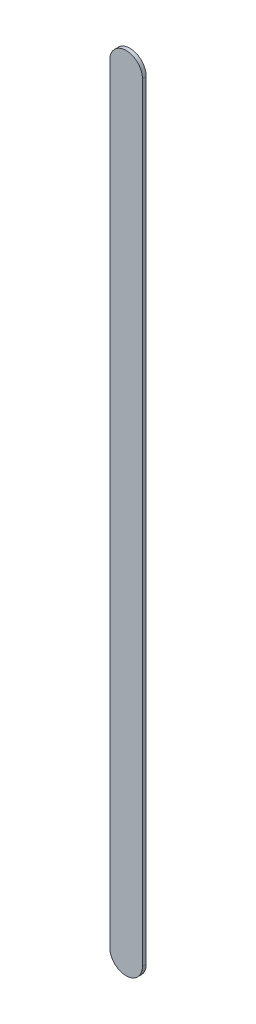
ISO-10303-21;
HEADER;
FILE_DESCRIPTION(('STEP AP214'),'2;1');
FILE_NAME('part.step','',(''),(''),'','','');
FILE_SCHEMA(('AUTOMOTIVE_DESIGN { 1 0 10303 214 1 1 1 1 }'));
ENDSEC;
DATA;
#1=APPLICATION_CONTEXT('core data for automotive mechanical design processes');
#2=APPLICATION_PROTOCOL_DEFINITION('international standard','automotive_design',2000,#1);
#3=PRODUCT_CONTEXT('',#1,'mechanical');
#4=PRODUCT('Part','Part','',(#3));
#5=PRODUCT_RELATED_PRODUCT_CATEGORY('part','',(#4));
#6=PRODUCT_DEFINITION_FORMATION('','',#4);
#7=PRODUCT_DEFINITION_CONTEXT('part definition',#1,'design');
#8=PRODUCT_DEFINITION('design','',#6,#7);
#9=PRODUCT_DEFINITION_SHAPE('','',#8);
#10=(LENGTH_UNIT() NAMED_UNIT(*) SI_UNIT(.MILLI.,.METRE.));
#11=(NAMED_UNIT(*) PLANE_ANGLE_UNIT() SI_UNIT($,.RADIAN.));
#12=(NAMED_UNIT(*) SI_UNIT($,.STERADIAN.) SOLID_ANGLE_UNIT());
#13=UNCERTAINTY_MEASURE_WITH_UNIT(LENGTH_MEASURE(1.E-05),#10,'distance_accuracy_value','');
#14=(GEOMETRIC_REPRESENTATION_CONTEXT(3) GLOBAL_UNCERTAINTY_ASSIGNED_CONTEXT((#13)) GLOBAL_UNIT_ASSIGNED_CONTEXT((#10,
#11,#12)) REPRESENTATION_CONTEXT('',''));
#15=CARTESIAN_POINT('',(0.,0.,0.));
#16=DIRECTION('',(0.,0.,1.));
#17=DIRECTION('',(1.,0.,0.));
#18=AXIS2_PLACEMENT_3D('',#15,#16,#17);
#19=CARTESIAN_POINT('',(121.64,-78.01,1.635));
#20=DIRECTION('',(0.,0.,1.));
#21=DIRECTION('',(1.,0.,0.));
#22=AXIS2_PLACEMENT_3D('',#19,#20,#21);
#23=PLANE('',#22);
#24=DIRECTION('',(0.,-1.,0.));
#25=VECTOR('',#24,1.);
#26=CARTESIAN_POINT('',(121.64,-78.01,1.635));
#27=LINE('',#26,#25);
#28=CARTESIAN_POINT('',(121.64,-78.01,1.635));
#29=VERTEX_POINT('',#28);
#30=CARTESIAN_POINT('',(121.64,-85.07,1.635));
#31=VERTEX_POINT('',#30);
#32=EDGE_CURVE('E79',#29,#31,#27,.T.);
#33=ORIENTED_EDGE('',*,*,#32,.T.);
#34=CARTESIAN_POINT('',(121.79,-85.07,1.635));
#35=DIRECTION('',(0.,0.,1.));
#36=DIRECTION('',(-1.,0.,0.));
#37=AXIS2_PLACEMENT_3D('',#34,#35,#36);
#38=CIRCLE('',#37,0.15);
#39=CARTESIAN_POINT('',(121.94,-85.07,1.635));
#40=VERTEX_POINT('',#39);
#41=EDGE_CURVE('E77',#31,#40,#38,.T.);
#42=ORIENTED_EDGE('',*,*,#41,.T.);
#43=DIRECTION('',(0.,1.,0.));
#44=VECTOR('',#43,1.);
#45=CARTESIAN_POINT('',(121.94,-85.07,1.635));
#46=LINE('',#45,#44);
#47=CARTESIAN_POINT('',(121.94,-78.01,1.635));
#48=VERTEX_POINT('',#47);
#49=EDGE_CURVE('E65',#40,#48,#46,.T.);
#50=ORIENTED_EDGE('',*,*,#49,.T.);
#51=CARTESIAN_POINT('',(121.79,-78.01,1.635));
#52=DIRECTION('',(0.,0.,1.));
#53=DIRECTION('',(1.,0.,0.));
#54=AXIS2_PLACEMENT_3D('',#51,#52,#53);
#55=CIRCLE('',#54,0.15);
#56=EDGE_CURVE('E11',#48,#29,#55,.T.);
#57=ORIENTED_EDGE('',*,*,#56,.T.);
#58=EDGE_LOOP('',(#33,#42,#50,#57));
#59=FACE_BOUND('',#58,.T.);
#60=ADVANCED_FACE('F17',(#59),#23,.T.);
#61=CARTESIAN_POINT('',(121.64,-78.01,1.6));
#62=DIRECTION('',(0.,0.,1.));
#63=DIRECTION('',(1.,0.,0.));
#64=AXIS2_PLACEMENT_3D('',#61,#62,#63);
#65=PLANE('',#64);
#66=CARTESIAN_POINT('',(121.79,-78.01,1.6));
#67=DIRECTION('',(0.,0.,1.));
#68=DIRECTION('',(1.,0.,0.));
#69=AXIS2_PLACEMENT_3D('',#66,#67,#68);
#70=CIRCLE('',#69,0.15);
#71=CARTESIAN_POINT('',(121.94,-78.01,1.6));
#72=VERTEX_POINT('',#71);
#73=CARTESIAN_POINT('',(121.64,-78.01,1.6));
#74=VERTEX_POINT('',#73);
#75=EDGE_CURVE('E26',#72,#74,#70,.T.);
#76=ORIENTED_EDGE('',*,*,#75,.F.);
#77=DIRECTION('',(0.,1.,0.));
#78=VECTOR('',#77,1.);
#79=CARTESIAN_POINT('',(121.94,-85.07,1.6));
#80=LINE('',#79,#78);
#81=CARTESIAN_POINT('',(121.94,-85.07,1.6));
#82=VERTEX_POINT('',#81);
#83=EDGE_CURVE('E84',#82,#72,#80,.T.);
#84=ORIENTED_EDGE('',*,*,#83,.F.);
#85=CARTESIAN_POINT('',(121.79,-85.07,1.6));
#86=DIRECTION('',(0.,0.,1.));
#87=DIRECTION('',(-1.,0.,0.));
#88=AXIS2_PLACEMENT_3D('',#85,#86,#87);
#89=CIRCLE('',#88,0.15);
#90=CARTESIAN_POINT('',(121.64,-85.07,1.6));
#91=VERTEX_POINT('',#90);
#92=EDGE_CURVE('E87',#91,#82,#89,.T.);
#93=ORIENTED_EDGE('',*,*,#92,.F.);
#94=DIRECTION('',(0.,-1.,0.));
#95=VECTOR('',#94,1.);
#96=CARTESIAN_POINT('',(121.64,-78.01,1.6));
#97=LINE('',#96,#95);
#98=EDGE_CURVE('E97',#74,#91,#97,.T.);
#99=ORIENTED_EDGE('',*,*,#98,.F.);
#100=EDGE_LOOP('',(#76,#84,#93,#99));
#101=FACE_BOUND('',#100,.T.);
#102=ADVANCED_FACE('F120',(#101),#65,.F.);
#103=CARTESIAN_POINT('',(121.79,-78.01,1.6));
#104=DIRECTION('',(0.,0.,-1.));
#105=DIRECTION('',(1.,0.,0.));
#106=AXIS2_PLACEMENT_3D('',#103,#104,#105);
#107=CYLINDRICAL_SURFACE('',#106,0.15);
#108=ORIENTED_EDGE('',*,*,#75,.T.);
#109=DIRECTION('',(0.,0.,1.));
#110=VECTOR('',#109,1.);
#111=CARTESIAN_POINT('',(121.64,-78.01,1.6));
#112=LINE('',#111,#110);
#113=EDGE_CURVE('E94',#74,#29,#112,.T.);
#114=ORIENTED_EDGE('',*,*,#113,.T.);
#115=ORIENTED_EDGE('',*,*,#56,.F.);
#116=DIRECTION('',(0.,0.,1.));
#117=VECTOR('',#116,1.);
#118=CARTESIAN_POINT('',(121.94,-78.01,1.6));
#119=LINE('',#118,#117);
#120=EDGE_CURVE('E72',#72,#48,#119,.T.);
#121=ORIENTED_EDGE('',*,*,#120,.F.);
#122=EDGE_LOOP('',(#108,#114,#115,#121));
#123=FACE_BOUND('',#122,.T.);
#124=ADVANCED_FACE('F115',(#123),#107,.T.);
#125=CARTESIAN_POINT('',(121.94,-85.07,1.6));
#126=DIRECTION('',(-1.,0.,0.));
#127=DIRECTION('',(0.,0.,1.));
#128=AXIS2_PLACEMENT_3D('',#125,#126,#127);
#129=PLANE('',#128);
#130=ORIENTED_EDGE('',*,*,#83,.T.);
#131=ORIENTED_EDGE('',*,*,#120,.T.);
#132=ORIENTED_EDGE('',*,*,#49,.F.);
#133=DIRECTION('',(0.,0.,1.));
#134=VECTOR('',#133,1.);
#135=CARTESIAN_POINT('',(121.94,-85.07,1.6));
#136=LINE('',#135,#134);
#137=EDGE_CURVE('E70',#82,#40,#136,.T.);
#138=ORIENTED_EDGE('',*,*,#137,.F.);
#139=EDGE_LOOP('',(#130,#131,#132,#138));
#140=FACE_BOUND('',#139,.T.);
#141=ADVANCED_FACE('F68',(#140),#129,.F.);
#142=CARTESIAN_POINT('',(121.79,-85.07,1.6));
#143=DIRECTION('',(0.,0.,-1.));
#144=DIRECTION('',(-1.,0.,0.));
#145=AXIS2_PLACEMENT_3D('',#142,#143,#144);
#146=CYLINDRICAL_SURFACE('',#145,0.15);
#147=ORIENTED_EDGE('',*,*,#92,.T.);
#148=ORIENTED_EDGE('',*,*,#137,.T.);
#149=ORIENTED_EDGE('',*,*,#41,.F.);
#150=DIRECTION('',(0.,0.,1.));
#151=VECTOR('',#150,1.);
#152=CARTESIAN_POINT('',(121.64,-85.07,1.6));
#153=LINE('',#152,#151);
#154=EDGE_CURVE('E101',#91,#31,#153,.T.);
#155=ORIENTED_EDGE('',*,*,#154,.F.);
#156=EDGE_LOOP('',(#147,#148,#149,#155));
#157=FACE_BOUND('',#156,.T.);
#158=ADVANCED_FACE('F86',(#157),#146,.T.);
#159=CARTESIAN_POINT('',(121.64,-78.01,1.6));
#160=DIRECTION('',(1.,0.,0.));
#161=DIRECTION('',(0.,1.,0.));
#162=AXIS2_PLACEMENT_3D('',#159,#160,#161);
#163=PLANE('',#162);
#164=ORIENTED_EDGE('',*,*,#98,.T.);
#165=ORIENTED_EDGE('',*,*,#154,.T.);
#166=ORIENTED_EDGE('',*,*,#32,.F.);
#167=ORIENTED_EDGE('',*,*,#113,.F.);
#168=EDGE_LOOP('',(#164,#165,#166,#167));
#169=FACE_BOUND('',#168,.T.);
#170=ADVANCED_FACE('F119',(#169),#163,.F.);
#171=CLOSED_SHELL('',(#60,#102,#124,#141,#158,#170));
#172=MANIFOLD_SOLID_BREP('B1',#171);
#173=ADVANCED_BREP_SHAPE_REPRESENTATION('',(#18,#172),#14);
#174=SHAPE_DEFINITION_REPRESENTATION(#9,#173);
ENDSEC;
END-ISO-10303-21;
